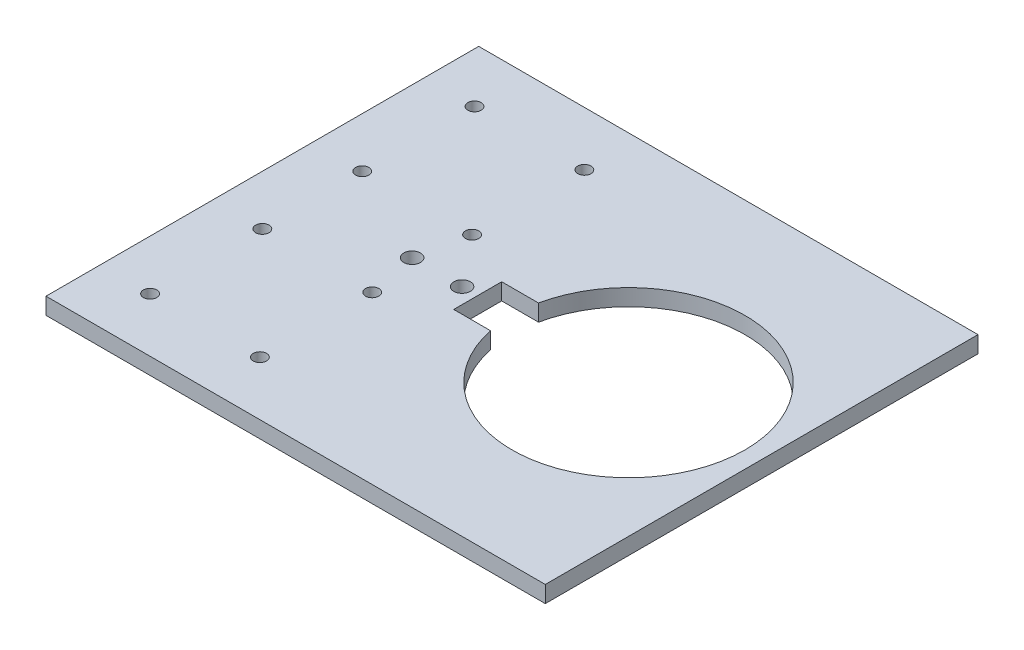
ISO-10303-21;
HEADER;
FILE_DESCRIPTION(('STEP AP214'),'2;1');
FILE_NAME('part.step','',(''),(''),'','','');
FILE_SCHEMA(('AUTOMOTIVE_DESIGN { 1 0 10303 214 1 1 1 1 }'));
ENDSEC;
DATA;
#1=APPLICATION_CONTEXT('core data for automotive mechanical design processes');
#2=APPLICATION_PROTOCOL_DEFINITION('international standard','automotive_design',2000,#1);
#3=PRODUCT_CONTEXT('',#1,'mechanical');
#4=PRODUCT('Part','Part','',(#3));
#5=PRODUCT_RELATED_PRODUCT_CATEGORY('part','',(#4));
#6=PRODUCT_DEFINITION_FORMATION('','',#4);
#7=PRODUCT_DEFINITION_CONTEXT('part definition',#1,'design');
#8=PRODUCT_DEFINITION('design','',#6,#7);
#9=PRODUCT_DEFINITION_SHAPE('','',#8);
#10=(LENGTH_UNIT() NAMED_UNIT(*) SI_UNIT(.MILLI.,.METRE.));
#11=(NAMED_UNIT(*) PLANE_ANGLE_UNIT() SI_UNIT($,.RADIAN.));
#12=(NAMED_UNIT(*) SI_UNIT($,.STERADIAN.) SOLID_ANGLE_UNIT());
#13=UNCERTAINTY_MEASURE_WITH_UNIT(LENGTH_MEASURE(1.E-05),#10,'distance_accuracy_value','');
#14=(GEOMETRIC_REPRESENTATION_CONTEXT(3) GLOBAL_UNCERTAINTY_ASSIGNED_CONTEXT((#13)) GLOBAL_UNIT_ASSIGNED_CONTEXT((#10,
#11,#12)) REPRESENTATION_CONTEXT('',''));
#15=CARTESIAN_POINT('',(0.,0.,0.));
#16=DIRECTION('',(0.,0.,1.));
#17=DIRECTION('',(1.,0.,0.));
#18=AXIS2_PLACEMENT_3D('',#15,#16,#17);
#19=CARTESIAN_POINT('',(0.,5.,0.));
#20=DIRECTION('',(0.,-1.,0.));
#21=DIRECTION('',(0.,0.,-1.));
#22=AXIS2_PLACEMENT_3D('',#19,#20,#21);
#23=PLANE('',#22);
#24=DIRECTION('',(0.,0.,-1.));
#25=VECTOR('',#24,1.);
#26=CARTESIAN_POINT('',(75.,5.,65.));
#27=LINE('',#26,#25);
#28=CARTESIAN_POINT('',(75.,5.,65.));
#29=VERTEX_POINT('',#28);
#30=CARTESIAN_POINT('',(75.,5.,-65.));
#31=VERTEX_POINT('',#30);
#32=EDGE_CURVE('E137',#29,#31,#27,.T.);
#33=ORIENTED_EDGE('',*,*,#32,.T.);
#34=DIRECTION('',(-1.,0.,0.));
#35=VECTOR('',#34,1.);
#36=CARTESIAN_POINT('',(-75.,5.,-65.));
#37=LINE('',#36,#35);
#38=CARTESIAN_POINT('',(-75.,5.,-65.));
#39=VERTEX_POINT('',#38);
#40=EDGE_CURVE('E140',#31,#39,#37,.T.);
#41=ORIENTED_EDGE('',*,*,#40,.T.);
#42=DIRECTION('',(0.,0.,1.));
#43=VECTOR('',#42,1.);
#44=CARTESIAN_POINT('',(-75.,5.,65.));
#45=LINE('',#44,#43);
#46=CARTESIAN_POINT('',(-75.,5.,65.));
#47=VERTEX_POINT('',#46);
#48=EDGE_CURVE('E143',#39,#47,#45,.T.);
#49=ORIENTED_EDGE('',*,*,#48,.T.);
#50=DIRECTION('',(1.,0.,0.));
#51=VECTOR('',#50,1.);
#52=CARTESIAN_POINT('',(-75.,5.,65.));
#53=LINE('',#52,#51);
#54=EDGE_CURVE('E145',#47,#29,#53,.T.);
#55=ORIENTED_EDGE('',*,*,#54,.T.);
#56=EDGE_LOOP('',(#33,#41,#49,#55));
#57=FACE_BOUND('',#56,.T.);
#58=DIRECTION('',(-1.,0.,0.));
#59=VECTOR('',#58,1.);
#60=CARTESIAN_POINT('',(0.750570036225924,5.,-7.20947620542134));
#61=LINE('',#60,#59);
#62=CARTESIAN_POINT('',(0.750570036225931,5.,-7.20947620542135));
#63=VERTEX_POINT('',#62);
#64=CARTESIAN_POINT('',(-10.3056835070418,5.,-7.20947620542134));
#65=VERTEX_POINT('',#64);
#66=EDGE_CURVE('E98',#63,#65,#61,.T.);
#67=ORIENTED_EDGE('',*,*,#66,.F.);
#68=CARTESIAN_POINT('',(35.,5.,0.));
#69=DIRECTION('',(0.,1.,0.));
#70=DIRECTION('',(0.,0.,1.));
#71=AXIS2_PLACEMENT_3D('',#68,#69,#70);
#72=CIRCLE('',#71,35.);
#73=CARTESIAN_POINT('',(0.750570036225924,5.,7.20947620542134));
#74=VERTEX_POINT('',#73);
#75=EDGE_CURVE('E121',#74,#63,#72,.T.);
#76=ORIENTED_EDGE('',*,*,#75,.F.);
#77=DIRECTION('',(1.,0.,0.));
#78=VECTOR('',#77,1.);
#79=CARTESIAN_POINT('',(0.750570036225924,5.,7.20947620542134));
#80=LINE('',#79,#78);
#81=CARTESIAN_POINT('',(-10.3056835070418,5.,7.20947620542135));
#82=VERTEX_POINT('',#81);
#83=EDGE_CURVE('E119',#82,#74,#80,.T.);
#84=ORIENTED_EDGE('',*,*,#83,.F.);
#85=DIRECTION('',(0.,0.,1.));
#86=VECTOR('',#85,1.);
#87=CARTESIAN_POINT('',(-10.3056835070418,5.,7.20947620542135));
#88=LINE('',#87,#86);
#89=EDGE_CURVE('E106',#65,#82,#88,.T.);
#90=ORIENTED_EDGE('',*,*,#89,.F.);
#91=EDGE_LOOP('',(#67,#76,#84,#90));
#92=FACE_BOUND('',#91,.T.);
#93=CARTESIAN_POINT('',(-15.0000000010044,5.,0.));
#94=DIRECTION('',(0.,1.,0.));
#95=DIRECTION('',(0.,0.,1.));
#96=AXIS2_PLACEMENT_3D('',#93,#94,#95);
#97=CIRCLE('',#96,2.50000000095962);
#98=CARTESIAN_POINT('',(-15.0000000010044,5.,2.50000000095961));
#99=VERTEX_POINT('',#98);
#100=EDGE_CURVE('E127',#99,#99,#97,.T.);
#101=ORIENTED_EDGE('',*,*,#100,.F.);
#102=EDGE_LOOP('',(#101));
#103=FACE_BOUND('',#102,.T.);
#104=CARTESIAN_POINT('',(-30.0000000010044,5.,0.));
#105=DIRECTION('',(0.,1.,0.));
#106=DIRECTION('',(0.,0.,1.));
#107=AXIS2_PLACEMENT_3D('',#104,#105,#106);
#108=CIRCLE('',#107,2.50000000095962);
#109=CARTESIAN_POINT('',(-30.0000000010044,5.,2.5000000009596));
#110=VERTEX_POINT('',#109);
#111=EDGE_CURVE('E309',#110,#110,#108,.T.);
#112=ORIENTED_EDGE('',*,*,#111,.F.);
#113=EDGE_LOOP('',(#112));
#114=FACE_BOUND('',#113,.T.);
#115=CARTESIAN_POINT('',(-60.,5.,15.));
#116=DIRECTION('',(0.,1.,0.));
#117=DIRECTION('',(0.,0.,1.));
#118=AXIS2_PLACEMENT_3D('',#115,#116,#117);
#119=CIRCLE('',#118,2.);
#120=CARTESIAN_POINT('',(-60.,5.,17.));
#121=VERTEX_POINT('',#120);
#122=EDGE_CURVE('E303',#121,#121,#119,.T.);
#123=ORIENTED_EDGE('',*,*,#122,.F.);
#124=EDGE_LOOP('',(#123));
#125=FACE_BOUND('',#124,.T.);
#126=CARTESIAN_POINT('',(-60.,5.,48.7377652054394));
#127=DIRECTION('',(0.,1.,0.));
#128=DIRECTION('',(0.,0.,1.));
#129=AXIS2_PLACEMENT_3D('',#126,#127,#128);
#130=CIRCLE('',#129,2.);
#131=CARTESIAN_POINT('',(-60.,5.,50.7377652054394));
#132=VERTEX_POINT('',#131);
#133=EDGE_CURVE('E297',#132,#132,#130,.T.);
#134=ORIENTED_EDGE('',*,*,#133,.F.);
#135=EDGE_LOOP('',(#134));
#136=FACE_BOUND('',#135,.T.);
#137=CARTESIAN_POINT('',(-27.,5.,48.7377652054394));
#138=DIRECTION('',(0.,1.,0.));
#139=DIRECTION('',(0.,0.,1.));
#140=AXIS2_PLACEMENT_3D('',#137,#138,#139);
#141=CIRCLE('',#140,2.);
#142=CARTESIAN_POINT('',(-27.,5.,50.7377652054394));
#143=VERTEX_POINT('',#142);
#144=EDGE_CURVE('E291',#143,#143,#141,.T.);
#145=ORIENTED_EDGE('',*,*,#144,.F.);
#146=EDGE_LOOP('',(#145));
#147=FACE_BOUND('',#146,.T.);
#148=CARTESIAN_POINT('',(-27.,5.,15.));
#149=DIRECTION('',(0.,1.,0.));
#150=DIRECTION('',(0.,0.,1.));
#151=AXIS2_PLACEMENT_3D('',#148,#149,#150);
#152=CIRCLE('',#151,2.);
#153=CARTESIAN_POINT('',(-27.,5.,17.));
#154=VERTEX_POINT('',#153);
#155=EDGE_CURVE('E285',#154,#154,#152,.T.);
#156=ORIENTED_EDGE('',*,*,#155,.F.);
#157=EDGE_LOOP('',(#156));
#158=FACE_BOUND('',#157,.T.);
#159=CARTESIAN_POINT('',(-27.,5.,-15.));
#160=DIRECTION('',(0.,1.,0.));
#161=DIRECTION('',(0.,0.,1.));
#162=AXIS2_PLACEMENT_3D('',#159,#160,#161);
#163=CIRCLE('',#162,2.00000000000001);
#164=CARTESIAN_POINT('',(-27.,5.,-13.));
#165=VERTEX_POINT('',#164);
#166=EDGE_CURVE('E279',#165,#165,#163,.T.);
#167=ORIENTED_EDGE('',*,*,#166,.F.);
#168=EDGE_LOOP('',(#167));
#169=FACE_BOUND('',#168,.T.);
#170=CARTESIAN_POINT('',(-60.,5.,-15.));
#171=DIRECTION('',(0.,1.,0.));
#172=DIRECTION('',(0.,0.,1.));
#173=AXIS2_PLACEMENT_3D('',#170,#171,#172);
#174=CIRCLE('',#173,2.);
#175=CARTESIAN_POINT('',(-60.,5.,-13.));
#176=VERTEX_POINT('',#175);
#177=EDGE_CURVE('E273',#176,#176,#174,.T.);
#178=ORIENTED_EDGE('',*,*,#177,.F.);
#179=EDGE_LOOP('',(#178));
#180=FACE_BOUND('',#179,.T.);
#181=CARTESIAN_POINT('',(-60.,5.,-48.7377652054394));
#182=DIRECTION('',(0.,1.,0.));
#183=DIRECTION('',(0.,0.,1.));
#184=AXIS2_PLACEMENT_3D('',#181,#182,#183);
#185=CIRCLE('',#184,2.);
#186=CARTESIAN_POINT('',(-60.,5.,-46.7377652054394));
#187=VERTEX_POINT('',#186);
#188=EDGE_CURVE('E267',#187,#187,#185,.T.);
#189=ORIENTED_EDGE('',*,*,#188,.F.);
#190=EDGE_LOOP('',(#189));
#191=FACE_BOUND('',#190,.T.);
#192=CARTESIAN_POINT('',(-27.,5.,-48.7377652054394));
#193=DIRECTION('',(0.,1.,0.));
#194=DIRECTION('',(0.,0.,1.));
#195=AXIS2_PLACEMENT_3D('',#192,#193,#194);
#196=CIRCLE('',#195,2.);
#197=CARTESIAN_POINT('',(-27.,5.,-46.7377652054394));
#198=VERTEX_POINT('',#197);
#199=EDGE_CURVE('E258',#198,#198,#196,.T.);
#200=ORIENTED_EDGE('',*,*,#199,.F.);
#201=EDGE_LOOP('',(#200));
#202=FACE_BOUND('',#201,.T.);
#203=ADVANCED_FACE('F33',(#57,#92,#103,#114,#125,#136,#147,#158,#169,#180,#191,#202),#23,.F.);
#204=CARTESIAN_POINT('',(0.,0.,0.));
#205=DIRECTION('',(0.,-1.,0.));
#206=DIRECTION('',(0.,0.,-1.));
#207=AXIS2_PLACEMENT_3D('',#204,#205,#206);
#208=PLANE('',#207);
#209=CARTESIAN_POINT('',(-60.,0.,-48.7377652054394));
#210=DIRECTION('',(0.,1.,0.));
#211=DIRECTION('',(0.,0.,1.));
#212=AXIS2_PLACEMENT_3D('',#209,#210,#211);
#213=CIRCLE('',#212,2.);
#214=CARTESIAN_POINT('',(-60.,0.,-46.7377652054394));
#215=VERTEX_POINT('',#214);
#216=EDGE_CURVE('E264',#215,#215,#213,.T.);
#217=ORIENTED_EDGE('',*,*,#216,.T.);
#218=EDGE_LOOP('',(#217));
#219=FACE_BOUND('',#218,.T.);
#220=CARTESIAN_POINT('',(-27.,0.,-15.));
#221=DIRECTION('',(0.,1.,0.));
#222=DIRECTION('',(0.,0.,1.));
#223=AXIS2_PLACEMENT_3D('',#220,#221,#222);
#224=CIRCLE('',#223,2.00000000000001);
#225=CARTESIAN_POINT('',(-27.,0.,-13.));
#226=VERTEX_POINT('',#225);
#227=EDGE_CURVE('E276',#226,#226,#224,.T.);
#228=ORIENTED_EDGE('',*,*,#227,.T.);
#229=EDGE_LOOP('',(#228));
#230=FACE_BOUND('',#229,.T.);
#231=CARTESIAN_POINT('',(-27.,0.,48.7377652054394));
#232=DIRECTION('',(0.,1.,0.));
#233=DIRECTION('',(0.,0.,1.));
#234=AXIS2_PLACEMENT_3D('',#231,#232,#233);
#235=CIRCLE('',#234,2.);
#236=CARTESIAN_POINT('',(-27.,0.,50.7377652054394));
#237=VERTEX_POINT('',#236);
#238=EDGE_CURVE('E288',#237,#237,#235,.T.);
#239=ORIENTED_EDGE('',*,*,#238,.T.);
#240=EDGE_LOOP('',(#239));
#241=FACE_BOUND('',#240,.T.);
#242=CARTESIAN_POINT('',(-60.,0.,15.));
#243=DIRECTION('',(0.,1.,0.));
#244=DIRECTION('',(0.,0.,1.));
#245=AXIS2_PLACEMENT_3D('',#242,#243,#244);
#246=CIRCLE('',#245,2.);
#247=CARTESIAN_POINT('',(-60.,0.,17.));
#248=VERTEX_POINT('',#247);
#249=EDGE_CURVE('E300',#248,#248,#246,.T.);
#250=ORIENTED_EDGE('',*,*,#249,.T.);
#251=EDGE_LOOP('',(#250));
#252=FACE_BOUND('',#251,.T.);
#253=CARTESIAN_POINT('',(-15.0000000010044,0.,0.));
#254=DIRECTION('',(0.,1.,0.));
#255=DIRECTION('',(0.,0.,1.));
#256=AXIS2_PLACEMENT_3D('',#253,#254,#255);
#257=CIRCLE('',#256,2.50000000095962);
#258=CARTESIAN_POINT('',(-15.0000000010044,0.,2.50000000095961));
#259=VERTEX_POINT('',#258);
#260=EDGE_CURVE('E312',#259,#259,#257,.T.);
#261=ORIENTED_EDGE('',*,*,#260,.T.);
#262=EDGE_LOOP('',(#261));
#263=FACE_BOUND('',#262,.T.);
#264=DIRECTION('',(0.,0.,-1.));
#265=VECTOR('',#264,1.);
#266=CARTESIAN_POINT('',(75.,0.,65.));
#267=LINE('',#266,#265);
#268=CARTESIAN_POINT('',(75.,0.,65.));
#269=VERTEX_POINT('',#268);
#270=CARTESIAN_POINT('',(75.,0.,-65.));
#271=VERTEX_POINT('',#270);
#272=EDGE_CURVE('E114',#269,#271,#267,.T.);
#273=ORIENTED_EDGE('',*,*,#272,.F.);
#274=DIRECTION('',(1.,0.,0.));
#275=VECTOR('',#274,1.);
#276=CARTESIAN_POINT('',(-75.,0.,65.));
#277=LINE('',#276,#275);
#278=CARTESIAN_POINT('',(-75.,0.,65.));
#279=VERTEX_POINT('',#278);
#280=EDGE_CURVE('E141',#279,#269,#277,.T.);
#281=ORIENTED_EDGE('',*,*,#280,.F.);
#282=DIRECTION('',(0.,0.,1.));
#283=VECTOR('',#282,1.);
#284=CARTESIAN_POINT('',(-75.,0.,65.));
#285=LINE('',#284,#283);
#286=CARTESIAN_POINT('',(-75.,0.,-65.));
#287=VERTEX_POINT('',#286);
#288=EDGE_CURVE('E152',#287,#279,#285,.T.);
#289=ORIENTED_EDGE('',*,*,#288,.F.);
#290=DIRECTION('',(-1.,0.,0.));
#291=VECTOR('',#290,1.);
#292=CARTESIAN_POINT('',(-75.,0.,-65.));
#293=LINE('',#292,#291);
#294=EDGE_CURVE('E150',#271,#287,#293,.T.);
#295=ORIENTED_EDGE('',*,*,#294,.F.);
#296=EDGE_LOOP('',(#273,#281,#289,#295));
#297=FACE_BOUND('',#296,.T.);
#298=CARTESIAN_POINT('',(35.,0.,0.));
#299=DIRECTION('',(0.,1.,0.));
#300=DIRECTION('',(0.,0.,1.));
#301=AXIS2_PLACEMENT_3D('',#298,#299,#300);
#302=CIRCLE('',#301,35.);
#303=CARTESIAN_POINT('',(0.750570036225924,0.,7.20947620542134));
#304=VERTEX_POINT('',#303);
#305=CARTESIAN_POINT('',(0.750570036225931,0.,-7.20947620542135));
#306=VERTEX_POINT('',#305);
#307=EDGE_CURVE('E107',#304,#306,#302,.T.);
#308=ORIENTED_EDGE('',*,*,#307,.T.);
#309=DIRECTION('',(-1.,0.,0.));
#310=VECTOR('',#309,1.);
#311=CARTESIAN_POINT('',(0.750570036225924,0.,-7.20947620542134));
#312=LINE('',#311,#310);
#313=CARTESIAN_POINT('',(-10.3056835070418,0.,-7.20947620542134));
#314=VERTEX_POINT('',#313);
#315=EDGE_CURVE('E56',#306,#314,#312,.T.);
#316=ORIENTED_EDGE('',*,*,#315,.T.);
#317=DIRECTION('',(0.,0.,1.));
#318=VECTOR('',#317,1.);
#319=CARTESIAN_POINT('',(-10.3056835070418,0.,7.20947620542135));
#320=LINE('',#319,#318);
#321=CARTESIAN_POINT('',(-10.3056835070418,0.,7.20947620542135));
#322=VERTEX_POINT('',#321);
#323=EDGE_CURVE('E113',#314,#322,#320,.T.);
#324=ORIENTED_EDGE('',*,*,#323,.T.);
#325=DIRECTION('',(1.,0.,0.));
#326=VECTOR('',#325,1.);
#327=CARTESIAN_POINT('',(0.750570036225924,0.,7.20947620542134));
#328=LINE('',#327,#326);
#329=EDGE_CURVE('E129',#322,#304,#328,.T.);
#330=ORIENTED_EDGE('',*,*,#329,.T.);
#331=EDGE_LOOP('',(#308,#316,#324,#330));
#332=FACE_BOUND('',#331,.T.);
#333=CARTESIAN_POINT('',(-30.0000000010044,0.,0.));
#334=DIRECTION('',(0.,1.,0.));
#335=DIRECTION('',(0.,0.,1.));
#336=AXIS2_PLACEMENT_3D('',#333,#334,#335);
#337=CIRCLE('',#336,2.50000000095962);
#338=CARTESIAN_POINT('',(-30.0000000010044,0.,2.5000000009596));
#339=VERTEX_POINT('',#338);
#340=EDGE_CURVE('E306',#339,#339,#337,.T.);
#341=ORIENTED_EDGE('',*,*,#340,.T.);
#342=EDGE_LOOP('',(#341));
#343=FACE_BOUND('',#342,.T.);
#344=CARTESIAN_POINT('',(-60.,0.,48.7377652054394));
#345=DIRECTION('',(0.,1.,0.));
#346=DIRECTION('',(0.,0.,1.));
#347=AXIS2_PLACEMENT_3D('',#344,#345,#346);
#348=CIRCLE('',#347,2.);
#349=CARTESIAN_POINT('',(-60.,0.,50.7377652054394));
#350=VERTEX_POINT('',#349);
#351=EDGE_CURVE('E294',#350,#350,#348,.T.);
#352=ORIENTED_EDGE('',*,*,#351,.T.);
#353=EDGE_LOOP('',(#352));
#354=FACE_BOUND('',#353,.T.);
#355=CARTESIAN_POINT('',(-27.,0.,15.));
#356=DIRECTION('',(0.,1.,0.));
#357=DIRECTION('',(0.,0.,1.));
#358=AXIS2_PLACEMENT_3D('',#355,#356,#357);
#359=CIRCLE('',#358,2.);
#360=CARTESIAN_POINT('',(-27.,0.,17.));
#361=VERTEX_POINT('',#360);
#362=EDGE_CURVE('E282',#361,#361,#359,.T.);
#363=ORIENTED_EDGE('',*,*,#362,.T.);
#364=EDGE_LOOP('',(#363));
#365=FACE_BOUND('',#364,.T.);
#366=CARTESIAN_POINT('',(-60.,0.,-15.));
#367=DIRECTION('',(0.,1.,0.));
#368=DIRECTION('',(0.,0.,1.));
#369=AXIS2_PLACEMENT_3D('',#366,#367,#368);
#370=CIRCLE('',#369,2.);
#371=CARTESIAN_POINT('',(-60.,0.,-13.));
#372=VERTEX_POINT('',#371);
#373=EDGE_CURVE('E270',#372,#372,#370,.T.);
#374=ORIENTED_EDGE('',*,*,#373,.T.);
#375=EDGE_LOOP('',(#374));
#376=FACE_BOUND('',#375,.T.);
#377=CARTESIAN_POINT('',(-27.,0.,-48.7377652054394));
#378=DIRECTION('',(0.,1.,0.));
#379=DIRECTION('',(0.,0.,1.));
#380=AXIS2_PLACEMENT_3D('',#377,#378,#379);
#381=CIRCLE('',#380,2.);
#382=CARTESIAN_POINT('',(-27.,0.,-46.7377652054394));
#383=VERTEX_POINT('',#382);
#384=EDGE_CURVE('E261',#383,#383,#381,.T.);
#385=ORIENTED_EDGE('',*,*,#384,.T.);
#386=EDGE_LOOP('',(#385));
#387=FACE_BOUND('',#386,.T.);
#388=ADVANCED_FACE('F170',(#219,#230,#241,#252,#263,#297,#332,#343,#354,#365,#376,#387),#208,.T.);
#389=CARTESIAN_POINT('',(75.,5.,65.));
#390=DIRECTION('',(-1.,0.,0.));
#391=DIRECTION('',(0.,0.,1.));
#392=AXIS2_PLACEMENT_3D('',#389,#390,#391);
#393=PLANE('',#392);
#394=ORIENTED_EDGE('',*,*,#272,.T.);
#395=DIRECTION('',(0.,-1.,0.));
#396=VECTOR('',#395,1.);
#397=CARTESIAN_POINT('',(75.,5.,-65.));
#398=LINE('',#397,#396);
#399=EDGE_CURVE('E11',#31,#271,#398,.T.);
#400=ORIENTED_EDGE('',*,*,#399,.F.);
#401=ORIENTED_EDGE('',*,*,#32,.F.);
#402=DIRECTION('',(0.,-1.,0.));
#403=VECTOR('',#402,1.);
#404=CARTESIAN_POINT('',(75.,5.,65.));
#405=LINE('',#404,#403);
#406=EDGE_CURVE('E147',#29,#269,#405,.T.);
#407=ORIENTED_EDGE('',*,*,#406,.T.);
#408=EDGE_LOOP('',(#394,#400,#401,#407));
#409=FACE_BOUND('',#408,.T.);
#410=ADVANCED_FACE('F35',(#409),#393,.F.);
#411=CARTESIAN_POINT('',(-75.,5.,-65.));
#412=DIRECTION('',(0.,0.,1.));
#413=DIRECTION('',(1.,0.,0.));
#414=AXIS2_PLACEMENT_3D('',#411,#412,#413);
#415=PLANE('',#414);
#416=ORIENTED_EDGE('',*,*,#294,.T.);
#417=DIRECTION('',(0.,-1.,0.));
#418=VECTOR('',#417,1.);
#419=CARTESIAN_POINT('',(-75.,5.,-65.));
#420=LINE('',#419,#418);
#421=EDGE_CURVE('E41',#39,#287,#420,.T.);
#422=ORIENTED_EDGE('',*,*,#421,.F.);
#423=ORIENTED_EDGE('',*,*,#40,.F.);
#424=ORIENTED_EDGE('',*,*,#399,.T.);
#425=EDGE_LOOP('',(#416,#422,#423,#424));
#426=FACE_BOUND('',#425,.T.);
#427=ADVANCED_FACE('F180',(#426),#415,.F.);
#428=CARTESIAN_POINT('',(-75.,5.,65.));
#429=DIRECTION('',(1.,0.,0.));
#430=DIRECTION('',(0.,0.,-1.));
#431=AXIS2_PLACEMENT_3D('',#428,#429,#430);
#432=PLANE('',#431);
#433=ORIENTED_EDGE('',*,*,#288,.T.);
#434=DIRECTION('',(0.,-1.,0.));
#435=VECTOR('',#434,1.);
#436=CARTESIAN_POINT('',(-75.,5.,65.));
#437=LINE('',#436,#435);
#438=EDGE_CURVE('E157',#47,#279,#437,.T.);
#439=ORIENTED_EDGE('',*,*,#438,.F.);
#440=ORIENTED_EDGE('',*,*,#48,.F.);
#441=ORIENTED_EDGE('',*,*,#421,.T.);
#442=EDGE_LOOP('',(#433,#439,#440,#441));
#443=FACE_BOUND('',#442,.T.);
#444=ADVANCED_FACE('F164',(#443),#432,.F.);
#445=CARTESIAN_POINT('',(-75.,5.,65.));
#446=DIRECTION('',(0.,0.,-1.));
#447=DIRECTION('',(-1.,0.,0.));
#448=AXIS2_PLACEMENT_3D('',#445,#446,#447);
#449=PLANE('',#448);
#450=ORIENTED_EDGE('',*,*,#280,.T.);
#451=ORIENTED_EDGE('',*,*,#406,.F.);
#452=ORIENTED_EDGE('',*,*,#54,.F.);
#453=ORIENTED_EDGE('',*,*,#438,.T.);
#454=EDGE_LOOP('',(#450,#451,#452,#453));
#455=FACE_BOUND('',#454,.T.);
#456=ADVANCED_FACE('F174',(#455),#449,.F.);
#457=CARTESIAN_POINT('',(0.750570036225924,5.,-7.20947620542134));
#458=DIRECTION('',(0.,0.,1.));
#459=DIRECTION('',(1.,0.,0.));
#460=AXIS2_PLACEMENT_3D('',#457,#458,#459);
#461=PLANE('',#460);
#462=ORIENTED_EDGE('',*,*,#315,.F.);
#463=DIRECTION('',(0.,-1.,0.));
#464=VECTOR('',#463,1.);
#465=CARTESIAN_POINT('',(0.750570036225931,5.,-7.20947620542135));
#466=LINE('',#465,#464);
#467=EDGE_CURVE('E102',#63,#306,#466,.T.);
#468=ORIENTED_EDGE('',*,*,#467,.F.);
#469=ORIENTED_EDGE('',*,*,#66,.T.);
#470=DIRECTION('',(0.,-1.,0.));
#471=VECTOR('',#470,1.);
#472=CARTESIAN_POINT('',(-10.3056835070418,5.,-7.20947620542134));
#473=LINE('',#472,#471);
#474=EDGE_CURVE('E101',#65,#314,#473,.T.);
#475=ORIENTED_EDGE('',*,*,#474,.T.);
#476=EDGE_LOOP('',(#462,#468,#469,#475));
#477=FACE_BOUND('',#476,.T.);
#478=ADVANCED_FACE('F100',(#477),#461,.T.);
#479=CARTESIAN_POINT('',(-10.3056835070418,5.,7.20947620542135));
#480=DIRECTION('',(1.,0.,0.));
#481=DIRECTION('',(0.,0.,-1.));
#482=AXIS2_PLACEMENT_3D('',#479,#480,#481);
#483=PLANE('',#482);
#484=ORIENTED_EDGE('',*,*,#323,.F.);
#485=ORIENTED_EDGE('',*,*,#474,.F.);
#486=ORIENTED_EDGE('',*,*,#89,.T.);
#487=DIRECTION('',(0.,-1.,0.));
#488=VECTOR('',#487,1.);
#489=CARTESIAN_POINT('',(-10.3056835070418,5.,7.20947620542135));
#490=LINE('',#489,#488);
#491=EDGE_CURVE('E115',#82,#322,#490,.T.);
#492=ORIENTED_EDGE('',*,*,#491,.T.);
#493=EDGE_LOOP('',(#484,#485,#486,#492));
#494=FACE_BOUND('',#493,.T.);
#495=ADVANCED_FACE('F110',(#494),#483,.T.);
#496=CARTESIAN_POINT('',(0.750570036225924,5.,7.20947620542134));
#497=DIRECTION('',(0.,0.,-1.));
#498=DIRECTION('',(-1.,0.,0.));
#499=AXIS2_PLACEMENT_3D('',#496,#497,#498);
#500=PLANE('',#499);
#501=ORIENTED_EDGE('',*,*,#329,.F.);
#502=ORIENTED_EDGE('',*,*,#491,.F.);
#503=ORIENTED_EDGE('',*,*,#83,.T.);
#504=DIRECTION('',(0.,-1.,0.));
#505=VECTOR('',#504,1.);
#506=CARTESIAN_POINT('',(0.750570036225924,5.,7.20947620542134));
#507=LINE('',#506,#505);
#508=EDGE_CURVE('E48',#74,#304,#507,.T.);
#509=ORIENTED_EDGE('',*,*,#508,.T.);
#510=EDGE_LOOP('',(#501,#502,#503,#509));
#511=FACE_BOUND('',#510,.T.);
#512=ADVANCED_FACE('F204',(#511),#500,.T.);
#513=CARTESIAN_POINT('',(35.,5.,0.));
#514=DIRECTION('',(0.,-1.,0.));
#515=DIRECTION('',(0.,0.,-1.));
#516=AXIS2_PLACEMENT_3D('',#513,#514,#515);
#517=CYLINDRICAL_SURFACE('',#516,35.);
#518=ORIENTED_EDGE('',*,*,#307,.F.);
#519=ORIENTED_EDGE('',*,*,#508,.F.);
#520=ORIENTED_EDGE('',*,*,#75,.T.);
#521=ORIENTED_EDGE('',*,*,#467,.T.);
#522=EDGE_LOOP('',(#518,#519,#520,#521));
#523=FACE_BOUND('',#522,.T.);
#524=ADVANCED_FACE('F208',(#523),#517,.F.);
#525=CARTESIAN_POINT('',(-15.0000000010044,5.,0.));
#526=DIRECTION('',(0.,-1.,0.));
#527=DIRECTION('',(0.,0.,-1.));
#528=AXIS2_PLACEMENT_3D('',#525,#526,#527);
#529=CYLINDRICAL_SURFACE('',#528,2.50000000095962);
#530=ORIENTED_EDGE('',*,*,#100,.T.);
#531=EDGE_LOOP('',(#530));
#532=FACE_BOUND('',#531,.T.);
#533=ORIENTED_EDGE('',*,*,#260,.F.);
#534=EDGE_LOOP('',(#533));
#535=FACE_BOUND('',#534,.T.);
#536=ADVANCED_FACE('F214',(#532,#535),#529,.F.);
#537=CARTESIAN_POINT('',(-30.0000000010044,5.,0.));
#538=DIRECTION('',(0.,-1.,0.));
#539=DIRECTION('',(0.,0.,-1.));
#540=AXIS2_PLACEMENT_3D('',#537,#538,#539);
#541=CYLINDRICAL_SURFACE('',#540,2.50000000095962);
#542=ORIENTED_EDGE('',*,*,#111,.T.);
#543=EDGE_LOOP('',(#542));
#544=FACE_BOUND('',#543,.T.);
#545=ORIENTED_EDGE('',*,*,#340,.F.);
#546=EDGE_LOOP('',(#545));
#547=FACE_BOUND('',#546,.T.);
#548=ADVANCED_FACE('F217',(#544,#547),#541,.F.);
#549=CARTESIAN_POINT('',(-60.,5.,15.));
#550=DIRECTION('',(0.,-1.,0.));
#551=DIRECTION('',(0.,0.,-1.));
#552=AXIS2_PLACEMENT_3D('',#549,#550,#551);
#553=CYLINDRICAL_SURFACE('',#552,2.);
#554=ORIENTED_EDGE('',*,*,#122,.T.);
#555=EDGE_LOOP('',(#554));
#556=FACE_BOUND('',#555,.T.);
#557=ORIENTED_EDGE('',*,*,#249,.F.);
#558=EDGE_LOOP('',(#557));
#559=FACE_BOUND('',#558,.T.);
#560=ADVANCED_FACE('F221',(#556,#559),#553,.F.);
#561=CARTESIAN_POINT('',(-60.,5.,48.7377652054394));
#562=DIRECTION('',(0.,-1.,0.));
#563=DIRECTION('',(0.,0.,-1.));
#564=AXIS2_PLACEMENT_3D('',#561,#562,#563);
#565=CYLINDRICAL_SURFACE('',#564,2.);
#566=ORIENTED_EDGE('',*,*,#133,.T.);
#567=EDGE_LOOP('',(#566));
#568=FACE_BOUND('',#567,.T.);
#569=ORIENTED_EDGE('',*,*,#351,.F.);
#570=EDGE_LOOP('',(#569));
#571=FACE_BOUND('',#570,.T.);
#572=ADVANCED_FACE('F225',(#568,#571),#565,.F.);
#573=CARTESIAN_POINT('',(-27.,5.,48.7377652054394));
#574=DIRECTION('',(0.,-1.,0.));
#575=DIRECTION('',(0.,0.,-1.));
#576=AXIS2_PLACEMENT_3D('',#573,#574,#575);
#577=CYLINDRICAL_SURFACE('',#576,2.);
#578=ORIENTED_EDGE('',*,*,#144,.T.);
#579=EDGE_LOOP('',(#578));
#580=FACE_BOUND('',#579,.T.);
#581=ORIENTED_EDGE('',*,*,#238,.F.);
#582=EDGE_LOOP('',(#581));
#583=FACE_BOUND('',#582,.T.);
#584=ADVANCED_FACE('F229',(#580,#583),#577,.F.);
#585=CARTESIAN_POINT('',(-27.,5.,15.));
#586=DIRECTION('',(0.,-1.,0.));
#587=DIRECTION('',(0.,0.,-1.));
#588=AXIS2_PLACEMENT_3D('',#585,#586,#587);
#589=CYLINDRICAL_SURFACE('',#588,2.);
#590=ORIENTED_EDGE('',*,*,#155,.T.);
#591=EDGE_LOOP('',(#590));
#592=FACE_BOUND('',#591,.T.);
#593=ORIENTED_EDGE('',*,*,#362,.F.);
#594=EDGE_LOOP('',(#593));
#595=FACE_BOUND('',#594,.T.);
#596=ADVANCED_FACE('F233',(#592,#595),#589,.F.);
#597=CARTESIAN_POINT('',(-27.,5.,-15.));
#598=DIRECTION('',(0.,-1.,0.));
#599=DIRECTION('',(0.,0.,-1.));
#600=AXIS2_PLACEMENT_3D('',#597,#598,#599);
#601=CYLINDRICAL_SURFACE('',#600,2.00000000000001);
#602=ORIENTED_EDGE('',*,*,#166,.T.);
#603=EDGE_LOOP('',(#602));
#604=FACE_BOUND('',#603,.T.);
#605=ORIENTED_EDGE('',*,*,#227,.F.);
#606=EDGE_LOOP('',(#605));
#607=FACE_BOUND('',#606,.T.);
#608=ADVANCED_FACE('F237',(#604,#607),#601,.F.);
#609=CARTESIAN_POINT('',(-60.,5.,-15.));
#610=DIRECTION('',(0.,-1.,0.));
#611=DIRECTION('',(0.,0.,-1.));
#612=AXIS2_PLACEMENT_3D('',#609,#610,#611);
#613=CYLINDRICAL_SURFACE('',#612,2.);
#614=ORIENTED_EDGE('',*,*,#177,.T.);
#615=EDGE_LOOP('',(#614));
#616=FACE_BOUND('',#615,.T.);
#617=ORIENTED_EDGE('',*,*,#373,.F.);
#618=EDGE_LOOP('',(#617));
#619=FACE_BOUND('',#618,.T.);
#620=ADVANCED_FACE('F241',(#616,#619),#613,.F.);
#621=CARTESIAN_POINT('',(-60.,5.,-48.7377652054394));
#622=DIRECTION('',(0.,-1.,0.));
#623=DIRECTION('',(0.,0.,-1.));
#624=AXIS2_PLACEMENT_3D('',#621,#622,#623);
#625=CYLINDRICAL_SURFACE('',#624,2.);
#626=ORIENTED_EDGE('',*,*,#188,.T.);
#627=EDGE_LOOP('',(#626));
#628=FACE_BOUND('',#627,.T.);
#629=ORIENTED_EDGE('',*,*,#216,.F.);
#630=EDGE_LOOP('',(#629));
#631=FACE_BOUND('',#630,.T.);
#632=ADVANCED_FACE('F245',(#628,#631),#625,.F.);
#633=CARTESIAN_POINT('',(-27.,5.,-48.7377652054394));
#634=DIRECTION('',(0.,-1.,0.));
#635=DIRECTION('',(0.,0.,-1.));
#636=AXIS2_PLACEMENT_3D('',#633,#634,#635);
#637=CYLINDRICAL_SURFACE('',#636,2.);
#638=ORIENTED_EDGE('',*,*,#199,.T.);
#639=EDGE_LOOP('',(#638));
#640=FACE_BOUND('',#639,.T.);
#641=ORIENTED_EDGE('',*,*,#384,.F.);
#642=EDGE_LOOP('',(#641));
#643=FACE_BOUND('',#642,.T.);
#644=ADVANCED_FACE('F249',(#640,#643),#637,.F.);
#645=CLOSED_SHELL('',(#203,#388,#410,#427,#444,#456,#478,#495,#512,#524,#536,#548,#560,#572,
#584,#596,#608,#620,#632,#644));
#646=MANIFOLD_SOLID_BREP('B2',#645);
#647=ADVANCED_BREP_SHAPE_REPRESENTATION('',(#18,#646),#14);
#648=SHAPE_DEFINITION_REPRESENTATION(#9,#647);
ENDSEC;
END-ISO-10303-21;
